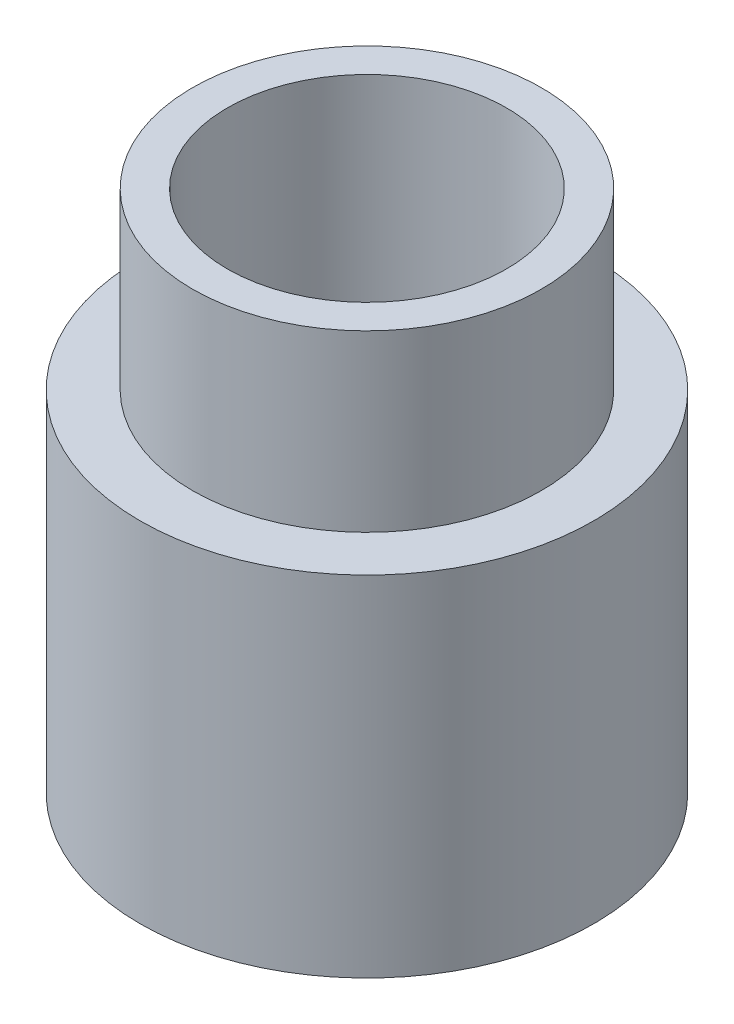
ISO-10303-21;
HEADER;
FILE_DESCRIPTION(('STEP AP214'),'2;1');
FILE_NAME('part.step','',(''),(''),'','','');
FILE_SCHEMA(('AUTOMOTIVE_DESIGN { 1 0 10303 214 1 1 1 1 }'));
ENDSEC;
DATA;
#1=APPLICATION_CONTEXT('core data for automotive mechanical design processes');
#2=APPLICATION_PROTOCOL_DEFINITION('international standard','automotive_design',2000,#1);
#3=PRODUCT_CONTEXT('',#1,'mechanical');
#4=PRODUCT('Part','Part','',(#3));
#5=PRODUCT_RELATED_PRODUCT_CATEGORY('part','',(#4));
#6=PRODUCT_DEFINITION_FORMATION('','',#4);
#7=PRODUCT_DEFINITION_CONTEXT('part definition',#1,'design');
#8=PRODUCT_DEFINITION('design','',#6,#7);
#9=PRODUCT_DEFINITION_SHAPE('','',#8);
#10=(LENGTH_UNIT() NAMED_UNIT(*) SI_UNIT(.MILLI.,.METRE.));
#11=(NAMED_UNIT(*) PLANE_ANGLE_UNIT() SI_UNIT($,.RADIAN.));
#12=(NAMED_UNIT(*) SI_UNIT($,.STERADIAN.) SOLID_ANGLE_UNIT());
#13=UNCERTAINTY_MEASURE_WITH_UNIT(LENGTH_MEASURE(1.E-05),#10,'distance_accuracy_value','');
#14=(GEOMETRIC_REPRESENTATION_CONTEXT(3) GLOBAL_UNCERTAINTY_ASSIGNED_CONTEXT((#13)) GLOBAL_UNIT_ASSIGNED_CONTEXT((#10,
#11,#12)) REPRESENTATION_CONTEXT('',''));
#15=CARTESIAN_POINT('',(0.,0.,0.));
#16=DIRECTION('',(0.,0.,1.));
#17=DIRECTION('',(1.,0.,0.));
#18=AXIS2_PLACEMENT_3D('',#15,#16,#17);
#19=CARTESIAN_POINT('',(0.,10.,0.));
#20=DIRECTION('',(0.,-1.,0.));
#21=DIRECTION('',(0.,0.,-1.));
#22=AXIS2_PLACEMENT_3D('',#19,#20,#21);
#23=CYLINDRICAL_SURFACE('',#22,6.5);
#24=CARTESIAN_POINT('',(0.,10.,0.));
#25=DIRECTION('',(0.,1.,0.));
#26=DIRECTION('',(0.,0.,1.));
#27=AXIS2_PLACEMENT_3D('',#24,#25,#26);
#28=CIRCLE('',#27,6.5);
#29=CARTESIAN_POINT('',(0.,10.,6.5));
#30=VERTEX_POINT('',#29);
#31=EDGE_CURVE('E47',#30,#30,#28,.T.);
#32=ORIENTED_EDGE('',*,*,#31,.F.);
#33=EDGE_LOOP('',(#32));
#34=FACE_BOUND('',#33,.T.);
#35=CARTESIAN_POINT('',(0.,0.,0.));
#36=DIRECTION('',(0.,1.,0.));
#37=DIRECTION('',(0.,0.,1.));
#38=AXIS2_PLACEMENT_3D('',#35,#36,#37);
#39=CIRCLE('',#38,6.5);
#40=CARTESIAN_POINT('',(0.,0.,6.5));
#41=VERTEX_POINT('',#40);
#42=EDGE_CURVE('E42',#41,#41,#39,.T.);
#43=ORIENTED_EDGE('',*,*,#42,.T.);
#44=EDGE_LOOP('',(#43));
#45=FACE_BOUND('',#44,.T.);
#46=ADVANCED_FACE('F39',(#34,#45),#23,.T.);
#47=CARTESIAN_POINT('',(0.,10.,0.));
#48=DIRECTION('',(0.,1.,0.));
#49=DIRECTION('',(0.,0.,1.));
#50=AXIS2_PLACEMENT_3D('',#47,#48,#49);
#51=PLANE('',#50);
#52=CARTESIAN_POINT('',(0.,10.,0.));
#53=DIRECTION('',(0.,1.,0.));
#54=DIRECTION('',(0.,0.,1.));
#55=AXIS2_PLACEMENT_3D('',#52,#53,#54);
#56=CIRCLE('',#55,5.);
#57=CARTESIAN_POINT('',(0.,10.,5.));
#58=VERTEX_POINT('',#57);
#59=EDGE_CURVE('E10',#58,#58,#56,.T.);
#60=ORIENTED_EDGE('',*,*,#59,.F.);
#61=EDGE_LOOP('',(#60));
#62=FACE_BOUND('',#61,.T.);
#63=ORIENTED_EDGE('',*,*,#31,.T.);
#64=EDGE_LOOP('',(#63));
#65=FACE_BOUND('',#64,.T.);
#66=ADVANCED_FACE('F93',(#62,#65),#51,.T.);
#67=CARTESIAN_POINT('',(0.,0.,0.));
#68=DIRECTION('',(0.,1.,0.));
#69=DIRECTION('',(0.,0.,1.));
#70=AXIS2_PLACEMENT_3D('',#67,#68,#69);
#71=PLANE('',#70);
#72=ORIENTED_EDGE('',*,*,#42,.F.);
#73=EDGE_LOOP('',(#72));
#74=FACE_BOUND('',#73,.T.);
#75=ADVANCED_FACE('F98',(#74),#71,.F.);
#76=CARTESIAN_POINT('',(0.,15.,0.));
#77=DIRECTION('',(0.,-1.,0.));
#78=DIRECTION('',(0.,0.,-1.));
#79=AXIS2_PLACEMENT_3D('',#76,#77,#78);
#80=CYLINDRICAL_SURFACE('',#79,5.);
#81=CARTESIAN_POINT('',(0.,15.,0.));
#82=DIRECTION('',(0.,1.,0.));
#83=DIRECTION('',(0.,0.,1.));
#84=AXIS2_PLACEMENT_3D('',#81,#82,#83);
#85=CIRCLE('',#84,5.);
#86=CARTESIAN_POINT('',(0.,15.,5.));
#87=VERTEX_POINT('',#86);
#88=EDGE_CURVE('E54',#87,#87,#85,.T.);
#89=ORIENTED_EDGE('',*,*,#88,.F.);
#90=EDGE_LOOP('',(#89));
#91=FACE_BOUND('',#90,.T.);
#92=ORIENTED_EDGE('',*,*,#59,.T.);
#93=EDGE_LOOP('',(#92));
#94=FACE_BOUND('',#93,.T.);
#95=ADVANCED_FACE('F108',(#91,#94),#80,.T.);
#96=CARTESIAN_POINT('',(0.,15.,0.));
#97=DIRECTION('',(0.,1.,0.));
#98=DIRECTION('',(0.,0.,1.));
#99=AXIS2_PLACEMENT_3D('',#96,#97,#98);
#100=PLANE('',#99);
#101=CARTESIAN_POINT('',(0.,15.,0.));
#102=DIRECTION('',(0.,1.,0.));
#103=DIRECTION('',(0.,0.,1.));
#104=AXIS2_PLACEMENT_3D('',#101,#102,#103);
#105=CIRCLE('',#104,4.);
#106=CARTESIAN_POINT('',(0.,15.,4.));
#107=VERTEX_POINT('',#106);
#108=EDGE_CURVE('E59',#107,#107,#105,.T.);
#109=ORIENTED_EDGE('',*,*,#108,.F.);
#110=EDGE_LOOP('',(#109));
#111=FACE_BOUND('',#110,.T.);
#112=ORIENTED_EDGE('',*,*,#88,.T.);
#113=EDGE_LOOP('',(#112));
#114=FACE_BOUND('',#113,.T.);
#115=ADVANCED_FACE('F90',(#111,#114),#100,.T.);
#116=CARTESIAN_POINT('',(0.,10.,0.));
#117=DIRECTION('',(0.,-1.,0.));
#118=DIRECTION('',(0.,0.,-1.));
#119=AXIS2_PLACEMENT_3D('',#116,#117,#118);
#120=CYLINDRICAL_SURFACE('',#119,5.5);
#121=CARTESIAN_POINT('',(0.,9.,0.));
#122=DIRECTION('',(0.,1.,0.));
#123=DIRECTION('',(0.,0.,1.));
#124=AXIS2_PLACEMENT_3D('',#121,#122,#123);
#125=CIRCLE('',#124,5.5);
#126=CARTESIAN_POINT('',(0.,9.,5.5));
#127=VERTEX_POINT('',#126);
#128=EDGE_CURVE('E67',#127,#127,#125,.T.);
#129=ORIENTED_EDGE('',*,*,#128,.T.);
#130=EDGE_LOOP('',(#129));
#131=FACE_BOUND('',#130,.T.);
#132=CARTESIAN_POINT('',(0.,0.999999999999999,0.));
#133=DIRECTION('',(0.,1.,0.));
#134=DIRECTION('',(0.,0.,1.));
#135=AXIS2_PLACEMENT_3D('',#132,#133,#134);
#136=CIRCLE('',#135,5.5);
#137=CARTESIAN_POINT('',(0.,0.999999999999999,5.5));
#138=VERTEX_POINT('',#137);
#139=EDGE_CURVE('E63',#138,#138,#136,.T.);
#140=ORIENTED_EDGE('',*,*,#139,.F.);
#141=EDGE_LOOP('',(#140));
#142=FACE_BOUND('',#141,.T.);
#143=ADVANCED_FACE('F75',(#131,#142),#120,.F.);
#144=CARTESIAN_POINT('',(0.,9.,0.));
#145=DIRECTION('',(0.,1.,0.));
#146=DIRECTION('',(0.,0.,1.));
#147=AXIS2_PLACEMENT_3D('',#144,#145,#146);
#148=PLANE('',#147);
#149=CARTESIAN_POINT('',(0.,9.,0.));
#150=DIRECTION('',(0.,1.,0.));
#151=DIRECTION('',(0.,0.,1.));
#152=AXIS2_PLACEMENT_3D('',#149,#150,#151);
#153=CIRCLE('',#152,4.);
#154=CARTESIAN_POINT('',(0.,9.,4.));
#155=VERTEX_POINT('',#154);
#156=EDGE_CURVE('E58',#155,#155,#153,.T.);
#157=ORIENTED_EDGE('',*,*,#156,.T.);
#158=EDGE_LOOP('',(#157));
#159=FACE_BOUND('',#158,.T.);
#160=ORIENTED_EDGE('',*,*,#128,.F.);
#161=EDGE_LOOP('',(#160));
#162=FACE_BOUND('',#161,.T.);
#163=ADVANCED_FACE('F78',(#159,#162),#148,.F.);
#164=CARTESIAN_POINT('',(0.,1.,0.));
#165=DIRECTION('',(0.,1.,0.));
#166=DIRECTION('',(0.,0.,1.));
#167=AXIS2_PLACEMENT_3D('',#164,#165,#166);
#168=PLANE('',#167);
#169=ORIENTED_EDGE('',*,*,#139,.T.);
#170=EDGE_LOOP('',(#169));
#171=FACE_BOUND('',#170,.T.);
#172=ADVANCED_FACE('F80',(#171),#168,.T.);
#173=CARTESIAN_POINT('',(0.,15.,0.));
#174=DIRECTION('',(0.,-1.,0.));
#175=DIRECTION('',(0.,0.,-1.));
#176=AXIS2_PLACEMENT_3D('',#173,#174,#175);
#177=CYLINDRICAL_SURFACE('',#176,4.);
#178=ORIENTED_EDGE('',*,*,#108,.T.);
#179=EDGE_LOOP('',(#178));
#180=FACE_BOUND('',#179,.T.);
#181=ORIENTED_EDGE('',*,*,#156,.F.);
#182=EDGE_LOOP('',(#181));
#183=FACE_BOUND('',#182,.T.);
#184=ADVANCED_FACE('F87',(#180,#183),#177,.F.);
#185=CLOSED_SHELL('',(#46,#66,#75,#95,#115,#143,#163,#172,#184));
#186=MANIFOLD_SOLID_BREP('B2',#185);
#187=ADVANCED_BREP_SHAPE_REPRESENTATION('',(#18,#186),#14);
#188=SHAPE_DEFINITION_REPRESENTATION(#9,#187);
ENDSEC;
END-ISO-10303-21;
